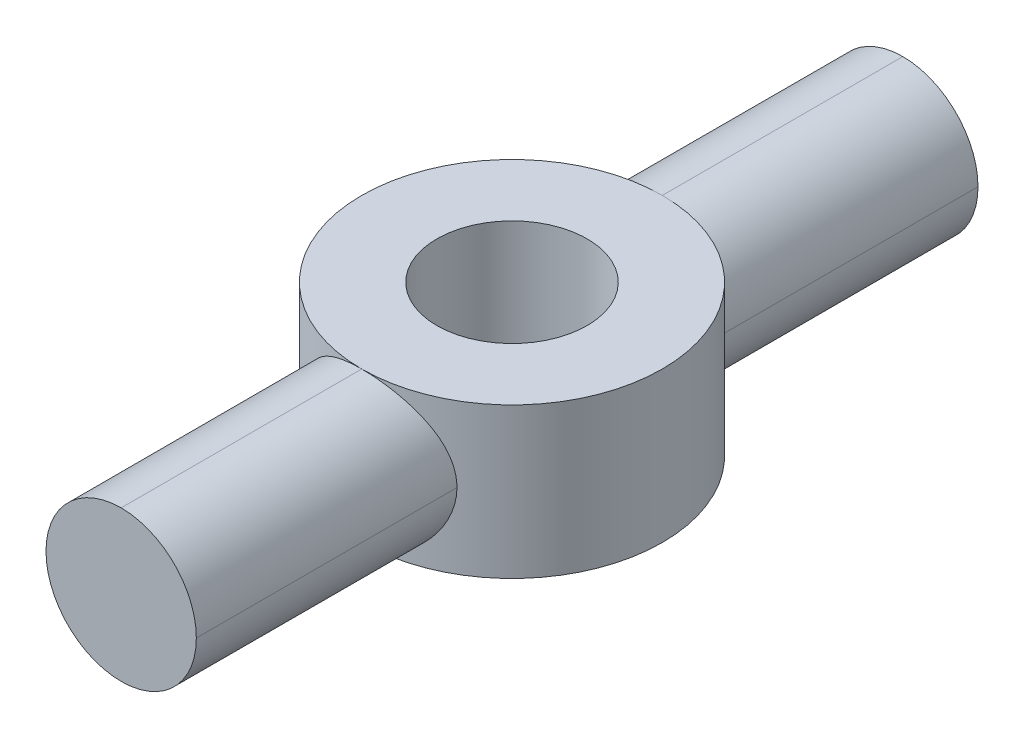
ISO-10303-21;
HEADER;
FILE_DESCRIPTION(('STEP AP214'),'2;1');
FILE_NAME('part.step','',(''),(''),'','','');
FILE_SCHEMA(('AUTOMOTIVE_DESIGN { 1 0 10303 214 1 1 1 1 }'));
ENDSEC;
DATA;
#1=APPLICATION_CONTEXT('core data for automotive mechanical design processes');
#2=APPLICATION_PROTOCOL_DEFINITION('international standard','automotive_design',2000,#1);
#3=PRODUCT_CONTEXT('',#1,'mechanical');
#4=PRODUCT('Part','Part','',(#3));
#5=PRODUCT_RELATED_PRODUCT_CATEGORY('part','',(#4));
#6=PRODUCT_DEFINITION_FORMATION('','',#4);
#7=PRODUCT_DEFINITION_CONTEXT('part definition',#1,'design');
#8=PRODUCT_DEFINITION('design','',#6,#7);
#9=PRODUCT_DEFINITION_SHAPE('','',#8);
#10=(LENGTH_UNIT() NAMED_UNIT(*) SI_UNIT(.MILLI.,.METRE.));
#11=(NAMED_UNIT(*) PLANE_ANGLE_UNIT() SI_UNIT($,.RADIAN.));
#12=(NAMED_UNIT(*) SI_UNIT($,.STERADIAN.) SOLID_ANGLE_UNIT());
#13=UNCERTAINTY_MEASURE_WITH_UNIT(LENGTH_MEASURE(1.E-05),#10,'distance_accuracy_value','');
#14=(GEOMETRIC_REPRESENTATION_CONTEXT(3) GLOBAL_UNCERTAINTY_ASSIGNED_CONTEXT((#13)) GLOBAL_UNIT_ASSIGNED_CONTEXT((#10,
#11,#12)) REPRESENTATION_CONTEXT('',''));
#15=CARTESIAN_POINT('',(0.,0.,0.));
#16=DIRECTION('',(0.,0.,1.));
#17=DIRECTION('',(1.,0.,0.));
#18=AXIS2_PLACEMENT_3D('',#15,#16,#17);
#19=CARTESIAN_POINT('',(0.,25.,0.));
#20=DIRECTION('',(0.,1.,0.));
#21=DIRECTION('',(0.,0.,1.));
#22=AXIS2_PLACEMENT_3D('',#19,#20,#21);
#23=PLANE('',#22);
#24=CARTESIAN_POINT('',(0.,25.,0.));
#25=DIRECTION('',(0.,1.,0.));
#26=DIRECTION('',(0.,0.,1.));
#27=AXIS2_PLACEMENT_3D('',#24,#25,#26);
#28=CIRCLE('',#27,25.);
#29=CARTESIAN_POINT('',(0.,25.,25.));
#30=VERTEX_POINT('',#29);
#31=CARTESIAN_POINT('',(0.,25.,-25.));
#32=VERTEX_POINT('',#31);
#33=EDGE_CURVE('E251',#30,#32,#28,.T.);
#34=ORIENTED_EDGE('',*,*,#33,.T.);
#35=CARTESIAN_POINT('',(0.,25.,0.));
#36=DIRECTION('',(0.,1.,0.));
#37=DIRECTION('',(0.,0.,1.));
#38=AXIS2_PLACEMENT_3D('',#35,#36,#37);
#39=CIRCLE('',#38,25.);
#40=EDGE_CURVE('E254',#32,#30,#39,.T.);
#41=ORIENTED_EDGE('',*,*,#40,.T.);
#42=EDGE_LOOP('',(#34,#41));
#43=FACE_BOUND('',#42,.T.);
#44=CARTESIAN_POINT('',(0.,25.,0.));
#45=DIRECTION('',(0.,1.,0.));
#46=DIRECTION('',(0.,0.,1.));
#47=AXIS2_PLACEMENT_3D('',#44,#45,#46);
#48=CIRCLE('',#47,12.5);
#49=CARTESIAN_POINT('',(0.,25.,12.5));
#50=VERTEX_POINT('',#49);
#51=EDGE_CURVE('E240',#50,#50,#48,.T.);
#52=ORIENTED_EDGE('',*,*,#51,.F.);
#53=EDGE_LOOP('',(#52));
#54=FACE_BOUND('',#53,.T.);
#55=ADVANCED_FACE('F39',(#43,#54),#23,.T.);
#56=CARTESIAN_POINT('',(0.,0.,0.));
#57=DIRECTION('',(0.,1.,0.));
#58=DIRECTION('',(0.,0.,1.));
#59=AXIS2_PLACEMENT_3D('',#56,#57,#58);
#60=PLANE('',#59);
#61=CARTESIAN_POINT('',(0.,0.,0.));
#62=DIRECTION('',(0.,1.,0.));
#63=DIRECTION('',(0.,0.,1.));
#64=AXIS2_PLACEMENT_3D('',#61,#62,#63);
#65=CIRCLE('',#64,25.);
#66=CARTESIAN_POINT('',(0.,0.,-25.));
#67=VERTEX_POINT('',#66);
#68=CARTESIAN_POINT('',(0.,0.,25.));
#69=VERTEX_POINT('',#68);
#70=EDGE_CURVE('E247',#67,#69,#65,.T.);
#71=ORIENTED_EDGE('',*,*,#70,.F.);
#72=CARTESIAN_POINT('',(0.,0.,0.));
#73=DIRECTION('',(0.,1.,0.));
#74=DIRECTION('',(0.,0.,1.));
#75=AXIS2_PLACEMENT_3D('',#72,#73,#74);
#76=CIRCLE('',#75,25.);
#77=EDGE_CURVE('E244',#69,#67,#76,.T.);
#78=ORIENTED_EDGE('',*,*,#77,.F.);
#79=EDGE_LOOP('',(#71,#78));
#80=FACE_BOUND('',#79,.T.);
#81=CARTESIAN_POINT('',(0.,0.,0.));
#82=DIRECTION('',(0.,1.,0.));
#83=DIRECTION('',(0.,0.,1.));
#84=AXIS2_PLACEMENT_3D('',#81,#82,#83);
#85=CIRCLE('',#84,12.5);
#86=CARTESIAN_POINT('',(0.,0.,12.5));
#87=VERTEX_POINT('',#86);
#88=EDGE_CURVE('E231',#87,#87,#85,.T.);
#89=ORIENTED_EDGE('',*,*,#88,.T.);
#90=EDGE_LOOP('',(#89));
#91=FACE_BOUND('',#90,.T.);
#92=ADVANCED_FACE('F288',(#80,#91),#60,.F.);
#93=CARTESIAN_POINT('',(0.,25.,0.));
#94=DIRECTION('',(0.,-1.,0.));
#95=DIRECTION('',(0.,0.,-1.));
#96=AXIS2_PLACEMENT_3D('',#93,#94,#95);
#97=CYLINDRICAL_SURFACE('',#96,25.);
#98=ORIENTED_EDGE('',*,*,#77,.T.);
#99=CARTESIAN_POINT('',(0.,0.,-25.));
#100=CARTESIAN_POINT('',(0.164998922422357,-8.90648917328034E-07,-25.0000019695635));
#101=CARTESIAN_POINT('',(0.329975670417893,0.0032676287503027,-24.9983659897053));
#102=CARTESIAN_POINT('',(0.659599416820261,0.0163252259183247,-24.9918404626365));
#103=CARTESIAN_POINT('',(0.824246429168667,0.0261140219044822,-24.9869510560272));
#104=CARTESIAN_POINT('',(1.31708098275089,0.0652175763232544,-24.967444099771));
#105=CARTESIAN_POINT('',(1.64436876130288,0.104269550422944,-24.9479877580473));
#106=CARTESIAN_POINT('',(2.29235058984424,0.207631241109895,-24.896793737564));
#107=CARTESIAN_POINT('',(2.61306795543266,0.271824588786111,-24.8651126518691));
#108=CARTESIAN_POINT('',(3.24724909796822,0.424745940587746,-24.7902665535785));
#109=CARTESIAN_POINT('',(3.56071242471605,0.51347546307269,-24.7471008302911));
#110=CARTESIAN_POINT('',(4.17790765339694,0.714403062051906,-24.6504067929638));
#111=CARTESIAN_POINT('',(4.48165143210082,0.826571128190825,-24.5968917365184));
#112=CARTESIAN_POINT('',(5.07806490386063,1.07338940045198,-24.4807184699777));
#113=CARTESIAN_POINT('',(5.37073364160213,1.20804154061498,-24.4180594733952));
#114=CARTESIAN_POINT('',(5.94367441674045,1.4988166803478,-24.2849606626622));
#115=CARTESIAN_POINT('',(6.22393543415515,1.65495827958384,-24.2145141187024));
#116=CARTESIAN_POINT('',(6.7704676377154,1.9874789192251,-24.0674233818478));
#117=CARTESIAN_POINT('',(7.03673828848529,2.1638587332741,-23.9907789520604));
#118=CARTESIAN_POINT('',(7.56959727027669,2.54685040486398,-23.8282049577776));
#119=CARTESIAN_POINT('',(7.83525441674854,2.75463881302192,-23.7419942336523));
#120=CARTESIAN_POINT('',(8.34842063243663,3.19047567378714,-23.5664475280418));
#121=CARTESIAN_POINT('',(8.5959239364977,3.41853051203442,-23.4771105669409));
#122=CARTESIAN_POINT('',(9.07172065626033,3.893780702224,-23.2973946102399));
#123=CARTESIAN_POINT('',(9.3000025772447,4.14098733998774,-23.2070150273502));
#124=CARTESIAN_POINT('',(9.73611580237835,4.65326685678325,-23.0274547656969));
#125=CARTESIAN_POINT('',(9.94394537049537,4.91834124924979,-22.9382741892608));
#126=CARTESIAN_POINT('',(10.3535404010566,5.48670165149851,-22.7564996839158));
#127=CARTESIAN_POINT('',(10.5535422414442,5.79135320424542,-22.6641892467875));
#128=CARTESIAN_POINT('',(10.9268817583784,6.41836201320146,-22.4865735904768));
#129=CARTESIAN_POINT('',(11.1002302188277,6.7407120366255,-22.4012655446882));
#130=CARTESIAN_POINT('',(11.4185337364695,7.400868634963,-22.2407020413406));
#131=CARTESIAN_POINT('',(11.5635357368727,7.73864849268024,-22.1654300304759));
#132=CARTESIAN_POINT('',(11.8238704553429,8.42793587977767,-22.0276602844232));
#133=CARTESIAN_POINT('',(11.9392116577903,8.77943945032072,-21.9651588972905));
#134=CARTESIAN_POINT('',(12.1146591681905,9.40739277159351,-21.8687556451945));
#135=CARTESIAN_POINT('',(12.1813779479061,9.68151339534363,-21.8315914614097));
#136=CARTESIAN_POINT('',(12.2962694236829,10.234710531481,-21.7670871792915));
#137=CARTESIAN_POINT('',(12.3444466944163,10.5137858036285,-21.7397446578099));
#138=CARTESIAN_POINT('',(12.4219262205729,11.0764087448165,-21.6955724645974));
#139=CARTESIAN_POINT('',(12.4511596841925,11.3599689254874,-21.6787811145958));
#140=CARTESIAN_POINT('',(12.4902197547954,11.9290103368439,-21.6562808009758));
#141=CARTESIAN_POINT('',(12.5000358702788,12.2144925224824,-21.6505778286113));
#142=CARTESIAN_POINT('',(12.5,12.5,-21.650635094611));
#143=B_SPLINE_CURVE_WITH_KNOTS('',3,(#99,#100,#101,#102,#103,#104,#105,#106,#107,#108,#109,#110,
#111,#112,#113,#114,#115,#116,#117,#118,#119,#120,#121,#122,#123,#124,#125,#126,#127,#128,#129,
#130,#131,#132,#133,#134,#135,#136,#137,#138,#139,#140,#141,#142),.UNSPECIFIED.,.F.,.F.,(4,2,2,
2,2,2,2,2,2,2,2,2,2,2,2,2,2,2,2,2,2,4),(0.,0.494912304531323,0.989803222140052,1.97896708372514,
2.96360562270925,3.94830510721608,4.93175143925854,5.91528240925596,6.89967006716264,
7.88409536768085,8.92732642456199,9.97088736090552,11.0150679967045,12.0593371881112,
13.1857673372061,14.311740528862,15.4358329534732,16.559603476321,17.4125284105116,
18.2652427708363,19.1210365455204,19.9772925929368),.UNSPECIFIED.);
#144=CARTESIAN_POINT('',(12.5,12.5,-21.650635094611));
#145=VERTEX_POINT('',#144);
#146=EDGE_CURVE('E137',#67,#145,#143,.T.);
#147=ORIENTED_EDGE('',*,*,#146,.T.);
#148=CARTESIAN_POINT('',(12.5,12.5,-21.650635094611));
#149=CARTESIAN_POINT('',(12.5000012155706,12.663691191665,-21.6506313376989));
#150=CARTESIAN_POINT('',(12.4967839172941,12.8273592498427,-21.6524922712817));
#151=CARTESIAN_POINT('',(12.4839334747655,13.154352814868,-21.6599050138347));
#152=CARTESIAN_POINT('',(12.4743006018249,13.3176783359084,-21.6654566667261));
#153=CARTESIAN_POINT('',(12.4358317759243,13.8064405771064,-21.6875776567157));
#154=CARTESIAN_POINT('',(12.3974255372317,14.1309420053489,-21.7096131545539));
#155=CARTESIAN_POINT('',(12.2959077537693,14.7728118120186,-21.767269110765));
#156=CARTESIAN_POINT('',(12.2329411673658,15.0902106961437,-21.8028098283959));
#157=CARTESIAN_POINT('',(12.0830703285232,15.7176791904052,-21.8862229501937));
#158=CARTESIAN_POINT('',(11.9961633282462,16.0277479547649,-21.9340967698911));
#159=CARTESIAN_POINT('',(11.7995846210819,16.6379144387548,-22.0404683749031));
#160=CARTESIAN_POINT('',(11.6899628141511,16.9380323694955,-22.0989428380424));
#161=CARTESIAN_POINT('',(11.448871030119,17.527397801775,-22.224802133824));
#162=CARTESIAN_POINT('',(11.3174013287724,17.8166454404575,-22.2921868540028));
#163=CARTESIAN_POINT('',(11.033461169929,18.3833074951614,-22.4340799874897));
#164=CARTESIAN_POINT('',(10.8809630009482,18.6607056533916,-22.5085977604961));
#165=CARTESIAN_POINT('',(10.5560514109956,19.2022027705624,-22.6627915595699));
#166=CARTESIAN_POINT('',(10.38363065668,19.4662967806587,-22.7424694802727));
#167=CARTESIAN_POINT('',(10.0050205719712,20.0010305491234,-22.9116996977276));
#168=CARTESIAN_POINT('',(9.79722384448561,20.2704462454088,-23.0015272282274));
#169=CARTESIAN_POINT('',(9.36064394602572,20.791188220685,-23.182626999424));
#170=CARTESIAN_POINT('',(9.1318597028853,21.0425135743426,-23.2738993137316));
#171=CARTESIAN_POINT('',(8.65431891033021,21.5259766953515,-23.4556614625387));
#172=CARTESIAN_POINT('',(8.40555317938189,21.7581055412879,-23.5461509159123));
#173=CARTESIAN_POINT('',(7.88938588682288,22.2017193745859,-23.7240824327609));
#174=CARTESIAN_POINT('',(7.6219906125325,22.4132112694588,-23.8115255095612));
#175=CARTESIAN_POINT('',(7.05083755926385,22.8280499306344,-23.9870989405053));
#176=CARTESIAN_POINT('',(6.74584359647365,23.0298525709004,-24.0748679502622));
#177=CARTESIAN_POINT('',(6.11760497807296,23.4068377232831,-24.2421237893675));
#178=CARTESIAN_POINT('',(5.79435855105031,23.5820176455385,-24.3216098127098));
#179=CARTESIAN_POINT('',(5.13213506919647,23.9037942682438,-24.4699031520947));
#180=CARTESIAN_POINT('',(4.79317990497371,24.0504293470586,-24.5387247805809));
#181=CARTESIAN_POINT('',(4.10160396764464,24.3137059868031,-24.6637428395453));
#182=CARTESIAN_POINT('',(3.74898675965502,24.4303553126727,-24.7199425380498));
#183=CARTESIAN_POINT('',(3.11740892001609,24.6083691233266,-24.8064122772121));
#184=CARTESIAN_POINT('',(2.84068325995922,24.6762838711451,-24.8396717537227));
#185=CARTESIAN_POINT('',(2.28237712260091,24.7931716259713,-24.8971782905126));
#186=CARTESIAN_POINT('',(2.00079773573281,24.8421488309969,-24.9214273481481));
#187=CARTESIAN_POINT('',(1.43359944658064,24.920825873603,-24.9604823575397));
#188=CARTESIAN_POINT('',(1.14797232346053,24.950478083362,-24.9752649770399));
#189=CARTESIAN_POINT('',(0.574902870650367,24.9900852875182,-24.9950432215544));
#190=CARTESIAN_POINT('',(0.2874598426997,25.0000321756213,-25.0000348187699));
#191=CARTESIAN_POINT('',(0.,25.,-25.));
#192=B_SPLINE_CURVE_WITH_KNOTS('',3,(#148,#149,#150,#151,#152,#153,#154,#155,#156,#157,#158,
#159,#160,#161,#162,#163,#164,#165,#166,#167,#168,#169,#170,#171,#172,#173,#174,#175,#176,#177,
#178,#179,#180,#181,#182,#183,#184,#185,#186,#187,#188,#189,#190,#191),.UNSPECIFIED.,.F.,.F.,(4,
2,2,2,2,2,2,2,2,2,2,2,2,2,2,2,2,2,2,2,2,4),(0.,0.490985691790432,0.981950621359605,
1.96304648596013,2.93843734308288,3.9139402005054,4.88732236791292,5.86069225064594,
6.83535732972393,7.81038232501835,8.86496160637205,9.9195947918894,10.9747153866281,
12.0294815957146,13.1563232850087,14.2832745235304,15.4086999565661,16.5338336615813,
17.3936960987468,18.2533678147467,19.1151503198043,19.9772872678476),.UNSPECIFIED.);
#193=EDGE_CURVE('E179',#145,#32,#192,.T.);
#194=ORIENTED_EDGE('',*,*,#193,.T.);
#195=ORIENTED_EDGE('',*,*,#33,.F.);
#196=CARTESIAN_POINT('',(0.,25.,25.));
#197=CARTESIAN_POINT('',(0.164998922422362,25.0000008906489,25.0000019695635));
#198=CARTESIAN_POINT('',(0.329975670417897,24.9967323712497,24.9983659897053));
#199=CARTESIAN_POINT('',(0.659599416820266,24.9836747740817,24.9918404626365));
#200=CARTESIAN_POINT('',(0.824246429168672,24.9738859780955,24.9869510560272));
#201=CARTESIAN_POINT('',(1.3170809827509,24.9347824236768,24.967444099771));
#202=CARTESIAN_POINT('',(1.64436876130289,24.8957304495771,24.9479877580473));
#203=CARTESIAN_POINT('',(2.29235058984425,24.7923687588901,24.896793737564));
#204=CARTESIAN_POINT('',(2.61306795543266,24.7281754112139,24.8651126518691));
#205=CARTESIAN_POINT('',(3.24724909796823,24.5752540594123,24.7902665535785));
#206=CARTESIAN_POINT('',(3.56071242471606,24.4865245369273,24.7471008302911));
#207=CARTESIAN_POINT('',(4.17790765339695,24.2855969379481,24.6504067929638));
#208=CARTESIAN_POINT('',(4.48165143210083,24.1734288718092,24.5968917365184));
#209=CARTESIAN_POINT('',(5.07806490386064,23.926610599548,24.4807184699777));
#210=CARTESIAN_POINT('',(5.37073364160214,23.791958459385,24.4180594733952));
#211=CARTESIAN_POINT('',(5.94367441674046,23.5011833196522,24.2849606626622));
#212=CARTESIAN_POINT('',(6.22393543415516,23.3450417204162,24.2145141187024));
#213=CARTESIAN_POINT('',(6.77046763771541,23.0125210807749,24.0674233818478));
#214=CARTESIAN_POINT('',(7.0367382884853,22.8361412667259,23.9907789520604));
#215=CARTESIAN_POINT('',(7.56959727027669,22.453149595136,23.8282049577776));
#216=CARTESIAN_POINT('',(7.83525441674855,22.2453611869781,23.7419942336523));
#217=CARTESIAN_POINT('',(8.34842063243664,21.8095243262129,23.5664475280418));
#218=CARTESIAN_POINT('',(8.5959239364977,21.5814694879656,23.4771105669409));
#219=CARTESIAN_POINT('',(9.07172065626034,21.106219297776,23.2973946102399));
#220=CARTESIAN_POINT('',(9.3000025772447,20.8590126600123,23.2070150273502));
#221=CARTESIAN_POINT('',(9.73611580237835,20.3467331432167,23.0274547656969));
#222=CARTESIAN_POINT('',(9.94394537049538,20.0816587507502,22.9382741892608));
#223=CARTESIAN_POINT('',(10.3535404010566,19.5132983485015,22.7564996839158));
#224=CARTESIAN_POINT('',(10.5535422414442,19.2086467957546,22.6641892467875));
#225=CARTESIAN_POINT('',(10.9268817583784,18.5816379867985,22.4865735904768));
#226=CARTESIAN_POINT('',(11.1002302188277,18.2592879633745,22.4012655446882));
#227=CARTESIAN_POINT('',(11.4185337364695,17.599131365037,22.2407020413406));
#228=CARTESIAN_POINT('',(11.5635357368727,17.2613515073198,22.1654300304759));
#229=CARTESIAN_POINT('',(11.8238704553429,16.5720641202223,22.0276602844232));
#230=CARTESIAN_POINT('',(11.9392116577903,16.2205605496793,21.9651588972905));
#231=CARTESIAN_POINT('',(12.1146591681905,15.5926072284065,21.8687556451945));
#232=CARTESIAN_POINT('',(12.1813779479061,15.3184866046564,21.8315914614097));
#233=CARTESIAN_POINT('',(12.2962694236829,14.765289468519,21.7670871792915));
#234=CARTESIAN_POINT('',(12.3444466944163,14.4862141963715,21.7397446578099));
#235=CARTESIAN_POINT('',(12.4219262205729,13.9235912551835,21.6955724645974));
#236=CARTESIAN_POINT('',(12.4511596841925,13.6400310745126,21.6787811145958));
#237=CARTESIAN_POINT('',(12.4902197547955,13.070989663156,21.6562808009757));
#238=CARTESIAN_POINT('',(12.5000358702788,12.7855074775176,21.6505778286113));
#239=CARTESIAN_POINT('',(12.5,12.5,21.650635094611));
#240=B_SPLINE_CURVE_WITH_KNOTS('',3,(#196,#197,#198,#199,#200,#201,#202,#203,#204,#205,#206,
#207,#208,#209,#210,#211,#212,#213,#214,#215,#216,#217,#218,#219,#220,#221,#222,#223,#224,#225,
#226,#227,#228,#229,#230,#231,#232,#233,#234,#235,#236,#237,#238,#239),.UNSPECIFIED.,.F.,.F.,(4,
2,2,2,2,2,2,2,2,2,2,2,2,2,2,2,2,2,2,2,2,4),(0.,0.494912304531323,0.989803222140052,
1.97896708372514,2.96360562270924,3.94830510721608,4.93175143925854,5.91528240925596,
6.89967006716264,7.88409536768085,8.92732642456199,9.97088736090553,11.0150679967045,
12.0593371881112,13.1857673372061,14.311740528862,15.4358329534732,16.559603476321,
17.4125284105116,18.2652427708363,19.1210365455204,19.9772925929368),.UNSPECIFIED.);
#241=CARTESIAN_POINT('',(12.5,12.5,21.650635094611));
#242=VERTEX_POINT('',#241);
#243=EDGE_CURVE('E50',#30,#242,#240,.T.);
#244=ORIENTED_EDGE('',*,*,#243,.T.);
#245=CARTESIAN_POINT('',(12.5,12.5,21.650635094611));
#246=CARTESIAN_POINT('',(12.5000012155706,12.336308808335,21.6506313376989));
#247=CARTESIAN_POINT('',(12.4967839172941,12.1726407501573,21.6524922712817));
#248=CARTESIAN_POINT('',(12.4839334747655,11.845647185132,21.6599050138347));
#249=CARTESIAN_POINT('',(12.474300601825,11.6823216640916,21.6654566667261));
#250=CARTESIAN_POINT('',(12.4358317759243,11.1935594228936,21.6875776567157));
#251=CARTESIAN_POINT('',(12.3974255372317,10.8690579946511,21.7096131545539));
#252=CARTESIAN_POINT('',(12.2959077537693,10.2271881879814,21.767269110765));
#253=CARTESIAN_POINT('',(12.2329411673658,9.90978930385628,21.8028098283959));
#254=CARTESIAN_POINT('',(12.0830703285232,9.28232080959476,21.8862229501937));
#255=CARTESIAN_POINT('',(11.9961633282462,8.97225204523507,21.9340967698911));
#256=CARTESIAN_POINT('',(11.7995846210819,8.36208556124515,22.0404683749031));
#257=CARTESIAN_POINT('',(11.6899628141511,8.06196763050449,22.0989428380423));
#258=CARTESIAN_POINT('',(11.448871030119,7.47260219822499,22.224802133824));
#259=CARTESIAN_POINT('',(11.3174013287724,7.18335455954254,22.2921868540028));
#260=CARTESIAN_POINT('',(11.033461169929,6.61669250483857,22.4340799874897));
#261=CARTESIAN_POINT('',(10.8809630009482,6.33929434660835,22.5085977604961));
#262=CARTESIAN_POINT('',(10.5560514109956,5.79779722943763,22.6627915595699));
#263=CARTESIAN_POINT('',(10.38363065668,5.53370321934133,22.7424694802727));
#264=CARTESIAN_POINT('',(10.0050205719712,4.99896945087655,22.9116996977276));
#265=CARTESIAN_POINT('',(9.79722384448561,4.72955375459118,23.0015272282274));
#266=CARTESIAN_POINT('',(9.36064394602572,4.20881177931501,23.182626999424));
#267=CARTESIAN_POINT('',(9.1318597028853,3.95748642565742,23.2738993137316));
#268=CARTESIAN_POINT('',(8.65431891033021,3.47402330464847,23.4556614625387));
#269=CARTESIAN_POINT('',(8.40555317938189,3.24189445871209,23.5461509159123));
#270=CARTESIAN_POINT('',(7.88938588682287,2.79828062541408,23.7240824327609));
#271=CARTESIAN_POINT('',(7.6219906125325,2.5867887305412,23.8115255095612));
#272=CARTESIAN_POINT('',(7.05083755926385,2.17195006936562,23.9870989405053));
#273=CARTESIAN_POINT('',(6.74584359647366,1.97014742909957,24.0748679502622));
#274=CARTESIAN_POINT('',(6.11760497807296,1.59316227671686,24.2421237893675));
#275=CARTESIAN_POINT('',(5.79435855105031,1.41798235446152,24.3216098127098));
#276=CARTESIAN_POINT('',(5.13213506919647,1.09620573175621,24.4699031520947));
#277=CARTESIAN_POINT('',(4.79317990497371,0.949570652941355,24.5387247805809));
#278=CARTESIAN_POINT('',(4.10160396764464,0.686294013196901,24.6637428395453));
#279=CARTESIAN_POINT('',(3.74898675965502,0.569644687327283,24.7199425380498));
#280=CARTESIAN_POINT('',(3.11740892001609,0.391630876673377,24.8064122772121));
#281=CARTESIAN_POINT('',(2.84068325995922,0.323716128854928,24.8396717537227));
#282=CARTESIAN_POINT('',(2.28237712260091,0.206828374028724,24.8971782905126));
#283=CARTESIAN_POINT('',(2.00079773573281,0.157851169003063,24.9214273481481));
#284=CARTESIAN_POINT('',(1.43359944658064,0.0791741263969788,24.9604823575397));
#285=CARTESIAN_POINT('',(1.14797232346053,0.0495219166379978,24.9752649770399));
#286=CARTESIAN_POINT('',(0.57490287065037,0.0099147124817967,24.9950432215544));
#287=CARTESIAN_POINT('',(0.287459842699703,-3.21756212584141E-05,25.0000348187699));
#288=CARTESIAN_POINT('',(0.,0.,25.));
#289=B_SPLINE_CURVE_WITH_KNOTS('',3,(#245,#246,#247,#248,#249,#250,#251,#252,#253,#254,#255,
#256,#257,#258,#259,#260,#261,#262,#263,#264,#265,#266,#267,#268,#269,#270,#271,#272,#273,#274,
#275,#276,#277,#278,#279,#280,#281,#282,#283,#284,#285,#286,#287,#288),.UNSPECIFIED.,.F.,.F.,(4,
2,2,2,2,2,2,2,2,2,2,2,2,2,2,2,2,2,2,2,2,4),(0.,0.490985691790432,0.981950621359605,
1.96304648596013,2.93843734308288,3.91394020050541,4.88732236791293,5.86069225064595,
6.83535732972393,7.81038232501835,8.86496160637206,9.91959479188941,10.9747153866281,
12.0294815957146,13.1563232850087,14.2832745235304,15.4086999565661,16.5338336615813,
17.3936960987468,18.2533678147467,19.1151503198043,19.9772872678476),.UNSPECIFIED.);
#290=EDGE_CURVE('E278',#242,#69,#289,.T.);
#291=ORIENTED_EDGE('',*,*,#290,.T.);
#292=EDGE_LOOP('',(#98,#147,#194,#195,#244,#291));
#293=FACE_BOUND('',#292,.T.);
#294=ADVANCED_FACE('F164',(#293),#97,.T.);
#295=CARTESIAN_POINT('',(-12.5,25.,-65.));
#296=DIRECTION('',(0.,0.,1.));
#297=DIRECTION('',(1.,0.,0.));
#298=AXIS2_PLACEMENT_3D('',#295,#296,#297);
#299=PLANE('',#298);
#300=CARTESIAN_POINT('',(0.,12.5,-65.));
#301=DIRECTION('',(0.,0.,1.));
#302=DIRECTION('',(1.,0.,0.));
#303=AXIS2_PLACEMENT_3D('',#300,#301,#302);
#304=CIRCLE('',#303,12.5);
#305=CARTESIAN_POINT('',(12.5,12.5,-65.));
#306=VERTEX_POINT('',#305);
#307=CARTESIAN_POINT('',(0.,0.,-65.));
#308=VERTEX_POINT('',#307);
#309=EDGE_CURVE('E263',#306,#308,#304,.F.);
#310=ORIENTED_EDGE('',*,*,#309,.T.);
#311=CARTESIAN_POINT('',(0.,12.5,-65.));
#312=DIRECTION('',(0.,0.,1.));
#313=DIRECTION('',(1.,0.,0.));
#314=AXIS2_PLACEMENT_3D('',#311,#312,#313);
#315=CIRCLE('',#314,12.5);
#316=CARTESIAN_POINT('',(-12.5,12.5,-65.));
#317=VERTEX_POINT('',#316);
#318=EDGE_CURVE('E266',#308,#317,#315,.F.);
#319=ORIENTED_EDGE('',*,*,#318,.T.);
#320=CARTESIAN_POINT('',(0.,12.5,-65.));
#321=DIRECTION('',(0.,0.,1.));
#322=DIRECTION('',(1.,0.,0.));
#323=AXIS2_PLACEMENT_3D('',#320,#321,#322);
#324=CIRCLE('',#323,12.5);
#325=CARTESIAN_POINT('',(0.,25.,-65.));
#326=VERTEX_POINT('',#325);
#327=EDGE_CURVE('E260',#317,#326,#324,.F.);
#328=ORIENTED_EDGE('',*,*,#327,.T.);
#329=CARTESIAN_POINT('',(0.,12.5,-65.));
#330=DIRECTION('',(0.,0.,1.));
#331=DIRECTION('',(1.,0.,0.));
#332=AXIS2_PLACEMENT_3D('',#329,#330,#331);
#333=CIRCLE('',#332,12.5);
#334=EDGE_CURVE('E257',#326,#306,#333,.F.);
#335=ORIENTED_EDGE('',*,*,#334,.T.);
#336=EDGE_LOOP('',(#310,#319,#328,#335));
#337=FACE_BOUND('',#336,.T.);
#338=ADVANCED_FACE('F303',(#337),#299,.F.);
#339=CARTESIAN_POINT('',(0.,25.,0.));
#340=DIRECTION('',(0.,-1.,0.));
#341=DIRECTION('',(0.,0.,-1.));
#342=AXIS2_PLACEMENT_3D('',#339,#340,#341);
#343=CYLINDRICAL_SURFACE('',#342,25.);
#344=ORIENTED_EDGE('',*,*,#70,.T.);
#345=CARTESIAN_POINT('',(0.,0.,25.));
#346=CARTESIAN_POINT('',(-0.164998922422357,-8.90648917710368E-07,25.0000019695635));
#347=CARTESIAN_POINT('',(-0.329975670417892,0.00326762875030213,24.9983659897053));
#348=CARTESIAN_POINT('',(-0.659599416820261,0.016325225918324,24.9918404626365));
#349=CARTESIAN_POINT('',(-0.824246429168667,0.0261140219044816,24.9869510560272));
#350=CARTESIAN_POINT('',(-1.31708098275089,0.065217576323254,24.967444099771));
#351=CARTESIAN_POINT('',(-1.64436876130288,0.104269550422944,24.9479877580473));
#352=CARTESIAN_POINT('',(-2.29235058984424,0.207631241109894,24.896793737564));
#353=CARTESIAN_POINT('',(-2.61306795543266,0.27182458878611,24.8651126518691));
#354=CARTESIAN_POINT('',(-3.24724909796822,0.424745940587745,24.7902665535785));
#355=CARTESIAN_POINT('',(-3.56071242471606,0.513475463072692,24.7471008302911));
#356=CARTESIAN_POINT('',(-4.17790765339694,0.714403062051908,24.6504067929638));
#357=CARTESIAN_POINT('',(-4.48165143210082,0.826571128190825,24.5968917365184));
#358=CARTESIAN_POINT('',(-5.07806490386064,1.07338940045198,24.4807184699777));
#359=CARTESIAN_POINT('',(-5.37073364160214,1.20804154061498,24.4180594733952));
#360=CARTESIAN_POINT('',(-5.94367441674046,1.4988166803478,24.2849606626622));
#361=CARTESIAN_POINT('',(-6.22393543415515,1.65495827958384,24.2145141187024));
#362=CARTESIAN_POINT('',(-6.77046763771541,1.98747891922511,24.0674233818478));
#363=CARTESIAN_POINT('',(-7.0367382884853,2.1638587332741,23.9907789520604));
#364=CARTESIAN_POINT('',(-7.56959727027669,2.54685040486398,23.8282049577776));
#365=CARTESIAN_POINT('',(-7.83525441674855,2.75463881302192,23.7419942336523));
#366=CARTESIAN_POINT('',(-8.34842063243664,3.19047567378715,23.5664475280418));
#367=CARTESIAN_POINT('',(-8.5959239364977,3.41853051203443,23.4771105669409));
#368=CARTESIAN_POINT('',(-9.07172065626034,3.89378070222401,23.2973946102399));
#369=CARTESIAN_POINT('',(-9.3000025772447,4.14098733998774,23.2070150273502));
#370=CARTESIAN_POINT('',(-9.73611580237835,4.65326685678326,23.0274547656969));
#371=CARTESIAN_POINT('',(-9.94394537049538,4.91834124924979,22.9382741892608));
#372=CARTESIAN_POINT('',(-10.3535404010566,5.48670165149851,22.7564996839158));
#373=CARTESIAN_POINT('',(-10.5535422414442,5.79135320424543,22.6641892467875));
#374=CARTESIAN_POINT('',(-10.9268817583784,6.41836201320147,22.4865735904768));
#375=CARTESIAN_POINT('',(-11.1002302188277,6.74071203662551,22.4012655446882));
#376=CARTESIAN_POINT('',(-11.4185337364695,7.400868634963,22.2407020413406));
#377=CARTESIAN_POINT('',(-11.5635357368727,7.73864849268025,22.1654300304759));
#378=CARTESIAN_POINT('',(-11.8238704553429,8.42793587977768,22.0276602844232));
#379=CARTESIAN_POINT('',(-11.9392116577903,8.77943945032073,21.9651588972905));
#380=CARTESIAN_POINT('',(-12.1146591681905,9.40739277159352,21.8687556451945));
#381=CARTESIAN_POINT('',(-12.1813779479061,9.68151339534363,21.8315914614097));
#382=CARTESIAN_POINT('',(-12.2962694236829,10.234710531481,21.7670871792915));
#383=CARTESIAN_POINT('',(-12.3444466944163,10.5137858036285,21.7397446578099));
#384=CARTESIAN_POINT('',(-12.4219262205729,11.0764087448165,21.6955724645974));
#385=CARTESIAN_POINT('',(-12.4511596841925,11.3599689254874,21.6787811145958));
#386=CARTESIAN_POINT('',(-12.4902197547954,11.9290103368439,21.6562808009758));
#387=CARTESIAN_POINT('',(-12.5000358702788,12.2144925224824,21.6505778286113));
#388=CARTESIAN_POINT('',(-12.5,12.5,21.650635094611));
#389=B_SPLINE_CURVE_WITH_KNOTS('',3,(#345,#346,#347,#348,#349,#350,#351,#352,#353,#354,#355,
#356,#357,#358,#359,#360,#361,#362,#363,#364,#365,#366,#367,#368,#369,#370,#371,#372,#373,#374,
#375,#376,#377,#378,#379,#380,#381,#382,#383,#384,#385,#386,#387,#388),.UNSPECIFIED.,.F.,.F.,(4,
2,2,2,2,2,2,2,2,2,2,2,2,2,2,2,2,2,2,2,2,4),(0.,0.494912304531323,0.989803222140052,
1.97896708372514,2.96360562270925,3.94830510721608,4.93175143925855,5.91528240925596,
6.89967006716265,7.88409536768086,8.92732642456199,9.97088736090553,11.0150679967045,
12.0593371881112,13.1857673372062,14.311740528862,15.4358329534732,16.559603476321,
17.4125284105116,18.2652427708363,19.1210365455204,19.9772925929368),.UNSPECIFIED.);
#390=CARTESIAN_POINT('',(-12.5,12.5,21.650635094611));
#391=VERTEX_POINT('',#390);
#392=EDGE_CURVE('E115',#69,#391,#389,.T.);
#393=ORIENTED_EDGE('',*,*,#392,.T.);
#394=CARTESIAN_POINT('',(-12.5,12.5,21.650635094611));
#395=CARTESIAN_POINT('',(-12.5000012155706,12.663691191665,21.6506313376989));
#396=CARTESIAN_POINT('',(-12.4967839172941,12.8273592498427,21.6524922712817));
#397=CARTESIAN_POINT('',(-12.4839334747655,13.154352814868,21.6599050138347));
#398=CARTESIAN_POINT('',(-12.4743006018249,13.3176783359084,21.6654566667261));
#399=CARTESIAN_POINT('',(-12.4358317759243,13.8064405771064,21.6875776567157));
#400=CARTESIAN_POINT('',(-12.3974255372317,14.1309420053489,21.7096131545539));
#401=CARTESIAN_POINT('',(-12.2959077537693,14.7728118120186,21.767269110765));
#402=CARTESIAN_POINT('',(-12.2329411673658,15.0902106961437,21.8028098283959));
#403=CARTESIAN_POINT('',(-12.0830703285232,15.7176791904052,21.8862229501937));
#404=CARTESIAN_POINT('',(-11.9961633282462,16.0277479547649,21.9340967698911));
#405=CARTESIAN_POINT('',(-11.7995846210819,16.6379144387548,22.0404683749031));
#406=CARTESIAN_POINT('',(-11.6899628141511,16.9380323694955,22.0989428380424));
#407=CARTESIAN_POINT('',(-11.448871030119,17.527397801775,22.224802133824));
#408=CARTESIAN_POINT('',(-11.3174013287724,17.8166454404575,22.2921868540028));
#409=CARTESIAN_POINT('',(-11.033461169929,18.3833074951614,22.4340799874897));
#410=CARTESIAN_POINT('',(-10.8809630009482,18.6607056533916,22.5085977604961));
#411=CARTESIAN_POINT('',(-10.5560514109956,19.2022027705624,22.6627915595699));
#412=CARTESIAN_POINT('',(-10.38363065668,19.4662967806587,22.7424694802727));
#413=CARTESIAN_POINT('',(-10.0050205719712,20.0010305491234,22.9116996977276));
#414=CARTESIAN_POINT('',(-9.79722384448561,20.2704462454088,23.0015272282274));
#415=CARTESIAN_POINT('',(-9.36064394602572,20.791188220685,23.182626999424));
#416=CARTESIAN_POINT('',(-9.1318597028853,21.0425135743426,23.2738993137316));
#417=CARTESIAN_POINT('',(-8.65431891033021,21.5259766953515,23.4556614625387));
#418=CARTESIAN_POINT('',(-8.40555317938189,21.7581055412879,23.5461509159123));
#419=CARTESIAN_POINT('',(-7.88938588682287,22.2017193745859,23.7240824327609));
#420=CARTESIAN_POINT('',(-7.6219906125325,22.4132112694588,23.8115255095612));
#421=CARTESIAN_POINT('',(-7.05083755926385,22.8280499306344,23.9870989405053));
#422=CARTESIAN_POINT('',(-6.74584359647365,23.0298525709004,24.0748679502622));
#423=CARTESIAN_POINT('',(-6.11760497807296,23.4068377232831,24.2421237893675));
#424=CARTESIAN_POINT('',(-5.79435855105031,23.5820176455385,24.3216098127098));
#425=CARTESIAN_POINT('',(-5.13213506919647,23.9037942682438,24.4699031520947));
#426=CARTESIAN_POINT('',(-4.79317990497371,24.0504293470586,24.5387247805809));
#427=CARTESIAN_POINT('',(-4.10160396764464,24.3137059868031,24.6637428395453));
#428=CARTESIAN_POINT('',(-3.74898675965502,24.4303553126727,24.7199425380498));
#429=CARTESIAN_POINT('',(-3.11740892001609,24.6083691233266,24.8064122772121));
#430=CARTESIAN_POINT('',(-2.84068325995922,24.6762838711451,24.8396717537227));
#431=CARTESIAN_POINT('',(-2.28237712260091,24.7931716259713,24.8971782905126));
#432=CARTESIAN_POINT('',(-2.00079773573281,24.8421488309969,24.9214273481481));
#433=CARTESIAN_POINT('',(-1.43359944658064,24.920825873603,24.9604823575397));
#434=CARTESIAN_POINT('',(-1.14797232346053,24.950478083362,24.9752649770399));
#435=CARTESIAN_POINT('',(-0.574902870650367,24.9900852875182,24.9950432215544));
#436=CARTESIAN_POINT('',(-0.287459842699699,25.0000321756213,25.0000348187699));
#437=CARTESIAN_POINT('',(0.,25.,25.));
#438=B_SPLINE_CURVE_WITH_KNOTS('',3,(#394,#395,#396,#397,#398,#399,#400,#401,#402,#403,#404,
#405,#406,#407,#408,#409,#410,#411,#412,#413,#414,#415,#416,#417,#418,#419,#420,#421,#422,#423,
#424,#425,#426,#427,#428,#429,#430,#431,#432,#433,#434,#435,#436,#437),.UNSPECIFIED.,.F.,.F.,(4,
2,2,2,2,2,2,2,2,2,2,2,2,2,2,2,2,2,2,2,2,4),(0.,0.490985691790434,0.981950621359607,
1.96304648596013,2.93843734308288,3.9139402005054,4.88732236791292,5.86069225064594,
6.83535732972393,7.81038232501835,8.86496160637205,9.9195947918894,10.9747153866281,
12.0294815957146,13.1563232850087,14.2832745235304,15.4086999565661,16.5338336615813,
17.3936960987468,18.2533678147466,19.1151503198043,19.9772872678476),.UNSPECIFIED.);
#439=EDGE_CURVE('E11',#391,#30,#438,.T.);
#440=ORIENTED_EDGE('',*,*,#439,.T.);
#441=ORIENTED_EDGE('',*,*,#40,.F.);
#442=CARTESIAN_POINT('',(0.,25.,-25.));
#443=CARTESIAN_POINT('',(-0.164998922422362,25.0000008906489,-25.0000019695635));
#444=CARTESIAN_POINT('',(-0.329975670417898,24.9967323712497,-24.9983659897053));
#445=CARTESIAN_POINT('',(-0.659599416820265,24.9836747740817,-24.9918404626365));
#446=CARTESIAN_POINT('',(-0.824246429168672,24.9738859780955,-24.9869510560272));
#447=CARTESIAN_POINT('',(-1.3170809827509,24.9347824236768,-24.967444099771));
#448=CARTESIAN_POINT('',(-1.64436876130289,24.8957304495771,-24.9479877580473));
#449=CARTESIAN_POINT('',(-2.29235058984425,24.7923687588901,-24.896793737564));
#450=CARTESIAN_POINT('',(-2.61306795543266,24.7281754112139,-24.8651126518691));
#451=CARTESIAN_POINT('',(-3.24724909796823,24.5752540594123,-24.7902665535785));
#452=CARTESIAN_POINT('',(-3.56071242471606,24.4865245369273,-24.7471008302911));
#453=CARTESIAN_POINT('',(-4.17790765339695,24.2855969379481,-24.6504067929638));
#454=CARTESIAN_POINT('',(-4.48165143210082,24.1734288718092,-24.5968917365184));
#455=CARTESIAN_POINT('',(-5.07806490386064,23.926610599548,-24.4807184699777));
#456=CARTESIAN_POINT('',(-5.37073364160214,23.791958459385,-24.4180594733952));
#457=CARTESIAN_POINT('',(-5.94367441674046,23.5011833196522,-24.2849606626622));
#458=CARTESIAN_POINT('',(-6.22393543415515,23.3450417204162,-24.2145141187024));
#459=CARTESIAN_POINT('',(-6.77046763771541,23.0125210807749,-24.0674233818478));
#460=CARTESIAN_POINT('',(-7.0367382884853,22.8361412667259,-23.9907789520604));
#461=CARTESIAN_POINT('',(-7.56959727027669,22.453149595136,-23.8282049577776));
#462=CARTESIAN_POINT('',(-7.83525441674854,22.2453611869781,-23.7419942336523));
#463=CARTESIAN_POINT('',(-8.34842063243664,21.8095243262129,-23.5664475280418));
#464=CARTESIAN_POINT('',(-8.5959239364977,21.5814694879656,-23.4771105669409));
#465=CARTESIAN_POINT('',(-9.07172065626034,21.106219297776,-23.2973946102399));
#466=CARTESIAN_POINT('',(-9.3000025772447,20.8590126600123,-23.2070150273502));
#467=CARTESIAN_POINT('',(-9.73611580237835,20.3467331432167,-23.0274547656969));
#468=CARTESIAN_POINT('',(-9.94394537049538,20.0816587507502,-22.9382741892608));
#469=CARTESIAN_POINT('',(-10.3535404010566,19.5132983485015,-22.7564996839158));
#470=CARTESIAN_POINT('',(-10.5535422414442,19.2086467957546,-22.6641892467875));
#471=CARTESIAN_POINT('',(-10.9268817583784,18.5816379867985,-22.4865735904768));
#472=CARTESIAN_POINT('',(-11.1002302188277,18.2592879633745,-22.4012655446882));
#473=CARTESIAN_POINT('',(-11.4185337364695,17.599131365037,-22.2407020413406));
#474=CARTESIAN_POINT('',(-11.5635357368727,17.2613515073198,-22.1654300304759));
#475=CARTESIAN_POINT('',(-11.8238704553429,16.5720641202223,-22.0276602844232));
#476=CARTESIAN_POINT('',(-11.9392116577903,16.2205605496793,-21.9651588972905));
#477=CARTESIAN_POINT('',(-12.1146591681905,15.5926072284065,-21.8687556451945));
#478=CARTESIAN_POINT('',(-12.1813779479061,15.3184866046564,-21.8315914614097));
#479=CARTESIAN_POINT('',(-12.2962694236829,14.765289468519,-21.7670871792915));
#480=CARTESIAN_POINT('',(-12.3444466944163,14.4862141963715,-21.7397446578099));
#481=CARTESIAN_POINT('',(-12.4219262205729,13.9235912551835,-21.6955724645974));
#482=CARTESIAN_POINT('',(-12.4511596841925,13.6400310745126,-21.6787811145958));
#483=CARTESIAN_POINT('',(-12.4902197547955,13.0709896631561,-21.6562808009758));
#484=CARTESIAN_POINT('',(-12.5000358702788,12.7855074775176,-21.6505778286113));
#485=CARTESIAN_POINT('',(-12.5,12.5,-21.650635094611));
#486=B_SPLINE_CURVE_WITH_KNOTS('',3,(#442,#443,#444,#445,#446,#447,#448,#449,#450,#451,#452,
#453,#454,#455,#456,#457,#458,#459,#460,#461,#462,#463,#464,#465,#466,#467,#468,#469,#470,#471,
#472,#473,#474,#475,#476,#477,#478,#479,#480,#481,#482,#483,#484,#485),.UNSPECIFIED.,.F.,.F.,(4,
2,2,2,2,2,2,2,2,2,2,2,2,2,2,2,2,2,2,2,2,4),(0.,0.494912304531323,0.989803222140052,
1.97896708372514,2.96360562270924,3.94830510721608,4.93175143925854,5.91528240925596,
6.89967006716264,7.88409536768085,8.92732642456198,9.97088736090552,11.0150679967045,
12.0593371881112,13.1857673372061,14.311740528862,15.4358329534732,16.559603476321,
17.4125284105116,18.2652427708363,19.1210365455204,19.9772925929368),.UNSPECIFIED.);
#487=CARTESIAN_POINT('',(-12.5,12.5,-21.650635094611));
#488=VERTEX_POINT('',#487);
#489=EDGE_CURVE('E172',#32,#488,#486,.T.);
#490=ORIENTED_EDGE('',*,*,#489,.T.);
#491=CARTESIAN_POINT('',(-12.5,12.5,-21.650635094611));
#492=CARTESIAN_POINT('',(-12.5000012155706,12.336308808335,-21.6506313376989));
#493=CARTESIAN_POINT('',(-12.4967839172941,12.1726407501573,-21.6524922712817));
#494=CARTESIAN_POINT('',(-12.4839334747655,11.845647185132,-21.6599050138347));
#495=CARTESIAN_POINT('',(-12.474300601825,11.6823216640916,-21.6654566667261));
#496=CARTESIAN_POINT('',(-12.4358317759243,11.1935594228936,-21.6875776567157));
#497=CARTESIAN_POINT('',(-12.3974255372317,10.8690579946511,-21.7096131545539));
#498=CARTESIAN_POINT('',(-12.2959077537693,10.2271881879814,-21.767269110765));
#499=CARTESIAN_POINT('',(-12.2329411673658,9.90978930385628,-21.8028098283959));
#500=CARTESIAN_POINT('',(-12.0830703285232,9.28232080959476,-21.8862229501937));
#501=CARTESIAN_POINT('',(-11.9961633282462,8.97225204523507,-21.9340967698911));
#502=CARTESIAN_POINT('',(-11.7995846210819,8.36208556124515,-22.0404683749031));
#503=CARTESIAN_POINT('',(-11.6899628141511,8.06196763050449,-22.0989428380424));
#504=CARTESIAN_POINT('',(-11.448871030119,7.47260219822499,-22.224802133824));
#505=CARTESIAN_POINT('',(-11.3174013287724,7.18335455954254,-22.2921868540028));
#506=CARTESIAN_POINT('',(-11.033461169929,6.61669250483857,-22.4340799874897));
#507=CARTESIAN_POINT('',(-10.8809630009482,6.33929434660835,-22.5085977604961));
#508=CARTESIAN_POINT('',(-10.5560514109956,5.79779722943763,-22.6627915595699));
#509=CARTESIAN_POINT('',(-10.38363065668,5.53370321934133,-22.7424694802727));
#510=CARTESIAN_POINT('',(-10.0050205719712,4.99896945087655,-22.9116996977276));
#511=CARTESIAN_POINT('',(-9.79722384448561,4.72955375459118,-23.0015272282274));
#512=CARTESIAN_POINT('',(-9.36064394602573,4.20881177931501,-23.182626999424));
#513=CARTESIAN_POINT('',(-9.13185970288531,3.95748642565743,-23.2738993137316));
#514=CARTESIAN_POINT('',(-8.65431891033022,3.47402330464847,-23.4556614625387));
#515=CARTESIAN_POINT('',(-8.4055531793819,3.24189445871209,-23.5461509159123));
#516=CARTESIAN_POINT('',(-7.88938588682288,2.79828062541408,-23.7240824327609));
#517=CARTESIAN_POINT('',(-7.6219906125325,2.5867887305412,-23.8115255095612));
#518=CARTESIAN_POINT('',(-7.05083755926385,2.17195006936562,-23.9870989405053));
#519=CARTESIAN_POINT('',(-6.74584359647366,1.97014742909957,-24.0748679502622));
#520=CARTESIAN_POINT('',(-6.11760497807297,1.59316227671686,-24.2421237893675));
#521=CARTESIAN_POINT('',(-5.79435855105032,1.41798235446153,-24.3216098127098));
#522=CARTESIAN_POINT('',(-5.13213506919647,1.09620573175621,-24.4699031520947));
#523=CARTESIAN_POINT('',(-4.79317990497371,0.949570652941354,-24.5387247805809));
#524=CARTESIAN_POINT('',(-4.10160396764465,0.6862940131969,-24.6637428395453));
#525=CARTESIAN_POINT('',(-3.74898675965503,0.569644687327284,-24.7199425380498));
#526=CARTESIAN_POINT('',(-3.1174089200161,0.391630876673379,-24.8064122772121));
#527=CARTESIAN_POINT('',(-2.84068325995922,0.323716128854931,-24.8396717537227));
#528=CARTESIAN_POINT('',(-2.28237712260092,0.206828374028724,-24.8971782905126));
#529=CARTESIAN_POINT('',(-2.00079773573282,0.15785116900306,-24.9214273481481));
#530=CARTESIAN_POINT('',(-1.43359944658065,0.0791741263969751,-24.9604823575397));
#531=CARTESIAN_POINT('',(-1.14797232346053,0.0495219166379952,-24.9752649770399));
#532=CARTESIAN_POINT('',(-0.574902870650375,0.00991471248179581,-24.9950432215544));
#533=CARTESIAN_POINT('',(-0.287459842699708,-3.21756212584898E-05,-25.0000348187699));
#534=CARTESIAN_POINT('',(0.,0.,-25.));
#535=B_SPLINE_CURVE_WITH_KNOTS('',3,(#491,#492,#493,#494,#495,#496,#497,#498,#499,#500,#501,
#502,#503,#504,#505,#506,#507,#508,#509,#510,#511,#512,#513,#514,#515,#516,#517,#518,#519,#520,
#521,#522,#523,#524,#525,#526,#527,#528,#529,#530,#531,#532,#533,#534),.UNSPECIFIED.,.F.,.F.,(4,
2,2,2,2,2,2,2,2,2,2,2,2,2,2,2,2,2,2,2,2,4),(0.,0.490985691790432,0.981950621359605,
1.96304648596014,2.93843734308288,3.91394020050541,4.88732236791293,5.86069225064595,
6.83535732972393,7.81038232501835,8.86496160637206,9.91959479188941,10.9747153866281,
12.0294815957146,13.1563232850087,14.2832745235304,15.4086999565661,16.5338336615813,
17.3936960987468,18.2533678147467,19.1151503198043,19.9772872678476),.UNSPECIFIED.);
#536=EDGE_CURVE('E133',#488,#67,#535,.T.);
#537=ORIENTED_EDGE('',*,*,#536,.T.);
#538=EDGE_LOOP('',(#344,#393,#440,#441,#490,#537));
#539=FACE_BOUND('',#538,.T.);
#540=ADVANCED_FACE('F154',(#539),#343,.T.);
#541=CARTESIAN_POINT('',(-12.5,25.,65.));
#542=DIRECTION('',(0.,0.,-1.));
#543=DIRECTION('',(-1.,0.,0.));
#544=AXIS2_PLACEMENT_3D('',#541,#542,#543);
#545=PLANE('',#544);
#546=CARTESIAN_POINT('',(0.,12.5,65.));
#547=DIRECTION('',(0.,0.,-1.));
#548=DIRECTION('',(-1.,0.,0.));
#549=AXIS2_PLACEMENT_3D('',#546,#547,#548);
#550=CIRCLE('',#549,12.5);
#551=CARTESIAN_POINT('',(0.,25.,65.));
#552=VERTEX_POINT('',#551);
#553=CARTESIAN_POINT('',(-12.5,12.5,65.));
#554=VERTEX_POINT('',#553);
#555=EDGE_CURVE('E131',#552,#554,#550,.F.);
#556=ORIENTED_EDGE('',*,*,#555,.T.);
#557=CARTESIAN_POINT('',(0.,12.5,65.));
#558=DIRECTION('',(0.,0.,-1.));
#559=DIRECTION('',(-1.,0.,0.));
#560=AXIS2_PLACEMENT_3D('',#557,#558,#559);
#561=CIRCLE('',#560,12.5);
#562=CARTESIAN_POINT('',(0.,0.,65.));
#563=VERTEX_POINT('',#562);
#564=EDGE_CURVE('E113',#554,#563,#561,.F.);
#565=ORIENTED_EDGE('',*,*,#564,.T.);
#566=CARTESIAN_POINT('',(0.,12.5,65.));
#567=DIRECTION('',(0.,0.,-1.));
#568=DIRECTION('',(-1.,0.,0.));
#569=AXIS2_PLACEMENT_3D('',#566,#567,#568);
#570=CIRCLE('',#569,12.5);
#571=CARTESIAN_POINT('',(12.5,12.5,65.));
#572=VERTEX_POINT('',#571);
#573=EDGE_CURVE('E122',#563,#572,#570,.F.);
#574=ORIENTED_EDGE('',*,*,#573,.T.);
#575=CARTESIAN_POINT('',(0.,12.5,65.));
#576=DIRECTION('',(0.,0.,-1.));
#577=DIRECTION('',(-1.,0.,0.));
#578=AXIS2_PLACEMENT_3D('',#575,#576,#577);
#579=CIRCLE('',#578,12.5);
#580=EDGE_CURVE('E127',#572,#552,#579,.F.);
#581=ORIENTED_EDGE('',*,*,#580,.T.);
#582=EDGE_LOOP('',(#556,#565,#574,#581));
#583=FACE_BOUND('',#582,.T.);
#584=ADVANCED_FACE('F129',(#583),#545,.F.);
#585=CARTESIAN_POINT('',(0.,25.,0.));
#586=DIRECTION('',(0.,-1.,0.));
#587=DIRECTION('',(0.,0.,-1.));
#588=AXIS2_PLACEMENT_3D('',#585,#586,#587);
#589=CYLINDRICAL_SURFACE('',#588,12.5);
#590=ORIENTED_EDGE('',*,*,#51,.T.);
#591=EDGE_LOOP('',(#590));
#592=FACE_BOUND('',#591,.T.);
#593=ORIENTED_EDGE('',*,*,#88,.F.);
#594=EDGE_LOOP('',(#593));
#595=FACE_BOUND('',#594,.T.);
#596=ADVANCED_FACE('F196',(#592,#595),#589,.F.);
#597=CARTESIAN_POINT('',(0.,12.5,0.));
#598=DIRECTION('',(0.,0.,1.));
#599=DIRECTION('',(1.,0.,0.));
#600=AXIS2_PLACEMENT_3D('',#597,#598,#599);
#601=CYLINDRICAL_SURFACE('',#600,12.5);
#602=DIRECTION('',(0.,0.,-1.));
#603=VECTOR('',#602,1.);
#604=CARTESIAN_POINT('',(0.,25.,-65.));
#605=LINE('',#604,#603);
#606=EDGE_CURVE('E223',#32,#326,#605,.T.);
#607=ORIENTED_EDGE('',*,*,#606,.F.);
#608=ORIENTED_EDGE('',*,*,#193,.F.);
#609=DIRECTION('',(0.,0.,-1.));
#610=VECTOR('',#609,1.);
#611=CARTESIAN_POINT('',(12.5,12.5,-21.650635094611));
#612=LINE('',#611,#610);
#613=EDGE_CURVE('E227',#306,#145,#612,.F.);
#614=ORIENTED_EDGE('',*,*,#613,.F.);
#615=ORIENTED_EDGE('',*,*,#334,.F.);
#616=EDGE_LOOP('',(#607,#608,#614,#615));
#617=FACE_BOUND('',#616,.T.);
#618=ADVANCED_FACE('F193',(#617),#601,.T.);
#619=CARTESIAN_POINT('',(0.,12.5,-65.));
#620=DIRECTION('',(0.,0.,-1.));
#621=DIRECTION('',(-1.,0.,0.));
#622=AXIS2_PLACEMENT_3D('',#619,#620,#621);
#623=CYLINDRICAL_SURFACE('',#622,12.5);
#624=ORIENTED_EDGE('',*,*,#613,.T.);
#625=ORIENTED_EDGE('',*,*,#146,.F.);
#626=DIRECTION('',(0.,0.,-1.));
#627=VECTOR('',#626,1.);
#628=CARTESIAN_POINT('',(0.,0.,0.));
#629=LINE('',#628,#627);
#630=EDGE_CURVE('E219',#308,#67,#629,.F.);
#631=ORIENTED_EDGE('',*,*,#630,.F.);
#632=ORIENTED_EDGE('',*,*,#309,.F.);
#633=EDGE_LOOP('',(#624,#625,#631,#632));
#634=FACE_BOUND('',#633,.T.);
#635=ADVANCED_FACE('F168',(#634),#623,.T.);
#636=CARTESIAN_POINT('',(0.,12.5,0.));
#637=DIRECTION('',(0.,0.,-1.));
#638=DIRECTION('',(-1.,0.,0.));
#639=AXIS2_PLACEMENT_3D('',#636,#637,#638);
#640=CYLINDRICAL_SURFACE('',#639,12.5);
#641=ORIENTED_EDGE('',*,*,#606,.T.);
#642=ORIENTED_EDGE('',*,*,#327,.F.);
#643=DIRECTION('',(0.,0.,1.));
#644=VECTOR('',#643,1.);
#645=CARTESIAN_POINT('',(-12.5,12.5,-65.));
#646=LINE('',#645,#644);
#647=EDGE_CURVE('E216',#488,#317,#646,.F.);
#648=ORIENTED_EDGE('',*,*,#647,.F.);
#649=ORIENTED_EDGE('',*,*,#489,.F.);
#650=EDGE_LOOP('',(#641,#642,#648,#649));
#651=FACE_BOUND('',#650,.T.);
#652=ADVANCED_FACE('F162',(#651),#640,.T.);
#653=CARTESIAN_POINT('',(0.,12.5,-65.));
#654=DIRECTION('',(0.,0.,1.));
#655=DIRECTION('',(1.,0.,0.));
#656=AXIS2_PLACEMENT_3D('',#653,#654,#655);
#657=CYLINDRICAL_SURFACE('',#656,12.5);
#658=ORIENTED_EDGE('',*,*,#318,.F.);
#659=ORIENTED_EDGE('',*,*,#630,.T.);
#660=ORIENTED_EDGE('',*,*,#536,.F.);
#661=ORIENTED_EDGE('',*,*,#647,.T.);
#662=EDGE_LOOP('',(#658,#659,#660,#661));
#663=FACE_BOUND('',#662,.T.);
#664=ADVANCED_FACE('F158',(#663),#657,.T.);
#665=CARTESIAN_POINT('',(0.,12.5,0.));
#666=DIRECTION('',(0.,0.,1.));
#667=DIRECTION('',(1.,0.,0.));
#668=AXIS2_PLACEMENT_3D('',#665,#666,#667);
#669=CYLINDRICAL_SURFACE('',#668,12.5);
#670=DIRECTION('',(0.,0.,-1.));
#671=VECTOR('',#670,1.);
#672=CARTESIAN_POINT('',(0.,25.,21.650635094611));
#673=LINE('',#672,#671);
#674=EDGE_CURVE('E119',#552,#30,#673,.T.);
#675=ORIENTED_EDGE('',*,*,#674,.F.);
#676=ORIENTED_EDGE('',*,*,#580,.F.);
#677=DIRECTION('',(0.,0.,-1.));
#678=VECTOR('',#677,1.);
#679=CARTESIAN_POINT('',(12.5,12.5,65.));
#680=LINE('',#679,#678);
#681=EDGE_CURVE('E44',#242,#572,#680,.F.);
#682=ORIENTED_EDGE('',*,*,#681,.F.);
#683=ORIENTED_EDGE('',*,*,#243,.F.);
#684=EDGE_LOOP('',(#675,#676,#682,#683));
#685=FACE_BOUND('',#684,.T.);
#686=ADVANCED_FACE('F41',(#685),#669,.T.);
#687=CARTESIAN_POINT('',(0.,12.5,21.650635094611));
#688=DIRECTION('',(0.,0.,-1.));
#689=DIRECTION('',(-1.,0.,0.));
#690=AXIS2_PLACEMENT_3D('',#687,#688,#689);
#691=CYLINDRICAL_SURFACE('',#690,12.5);
#692=ORIENTED_EDGE('',*,*,#681,.T.);
#693=ORIENTED_EDGE('',*,*,#573,.F.);
#694=DIRECTION('',(0.,0.,-1.));
#695=VECTOR('',#694,1.);
#696=CARTESIAN_POINT('',(0.,0.,0.));
#697=LINE('',#696,#695);
#698=EDGE_CURVE('E109',#69,#563,#697,.F.);
#699=ORIENTED_EDGE('',*,*,#698,.F.);
#700=ORIENTED_EDGE('',*,*,#290,.F.);
#701=EDGE_LOOP('',(#692,#693,#699,#700));
#702=FACE_BOUND('',#701,.T.);
#703=ADVANCED_FACE('F123',(#702),#691,.T.);
#704=CARTESIAN_POINT('',(0.,12.5,0.));
#705=DIRECTION('',(0.,0.,-1.));
#706=DIRECTION('',(-1.,0.,0.));
#707=AXIS2_PLACEMENT_3D('',#704,#705,#706);
#708=CYLINDRICAL_SURFACE('',#707,12.5);
#709=ORIENTED_EDGE('',*,*,#674,.T.);
#710=ORIENTED_EDGE('',*,*,#439,.F.);
#711=DIRECTION('',(0.,0.,1.));
#712=VECTOR('',#711,1.);
#713=CARTESIAN_POINT('',(-12.5,12.5,21.650635094611));
#714=LINE('',#713,#712);
#715=EDGE_CURVE('E65',#554,#391,#714,.F.);
#716=ORIENTED_EDGE('',*,*,#715,.F.);
#717=ORIENTED_EDGE('',*,*,#555,.F.);
#718=EDGE_LOOP('',(#709,#710,#716,#717));
#719=FACE_BOUND('',#718,.T.);
#720=ADVANCED_FACE('F201',(#719),#708,.T.);
#721=CARTESIAN_POINT('',(0.,12.5,21.650635094611));
#722=DIRECTION('',(0.,0.,1.));
#723=DIRECTION('',(1.,0.,0.));
#724=AXIS2_PLACEMENT_3D('',#721,#722,#723);
#725=CYLINDRICAL_SURFACE('',#724,12.5);
#726=ORIENTED_EDGE('',*,*,#392,.F.);
#727=ORIENTED_EDGE('',*,*,#698,.T.);
#728=ORIENTED_EDGE('',*,*,#564,.F.);
#729=ORIENTED_EDGE('',*,*,#715,.T.);
#730=EDGE_LOOP('',(#726,#727,#728,#729));
#731=FACE_BOUND('',#730,.T.);
#732=ADVANCED_FACE('F111',(#731),#725,.T.);
#733=CLOSED_SHELL('',(#55,#92,#294,#338,#540,#584,#596,#618,#635,#652,#664,#686,#703,#720,#732));
#734=MANIFOLD_SOLID_BREP('B2',#733);
#735=ADVANCED_BREP_SHAPE_REPRESENTATION('',(#18,#734),#14);
#736=SHAPE_DEFINITION_REPRESENTATION(#9,#735);
ENDSEC;
END-ISO-10303-21;
